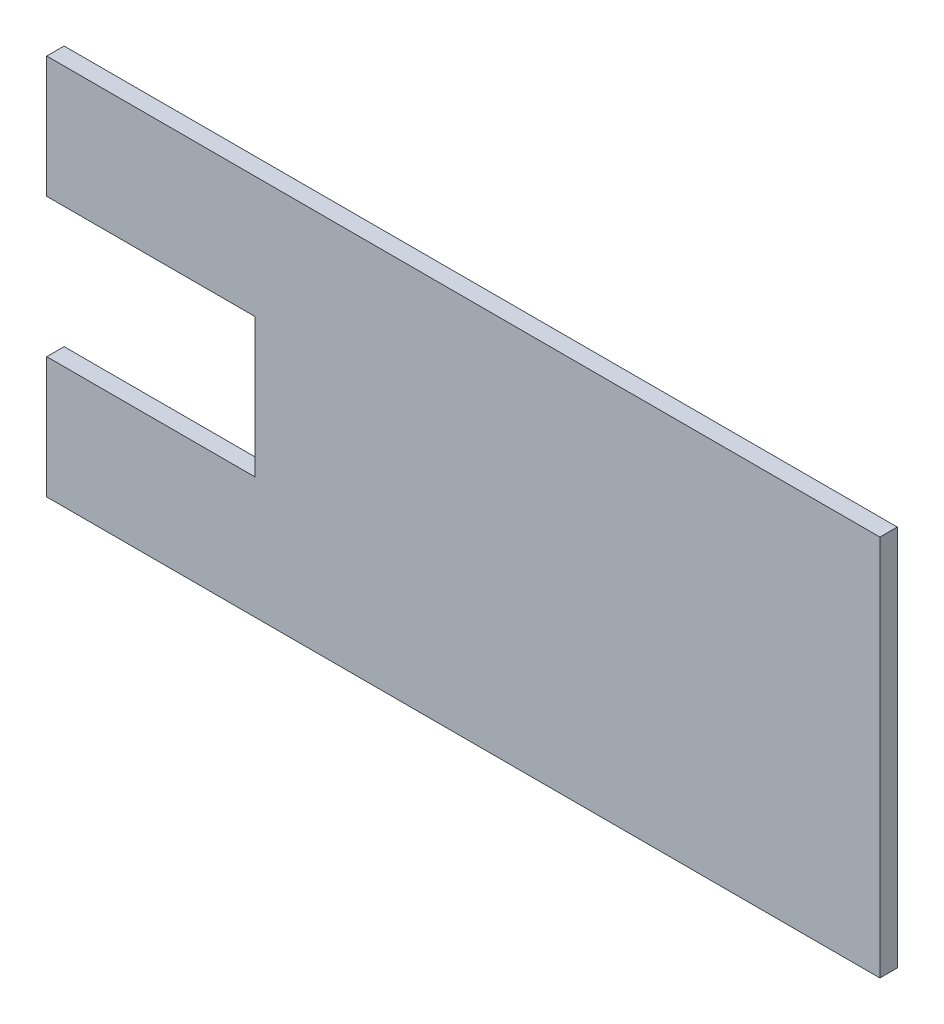
ISO-10303-21;
HEADER;
FILE_DESCRIPTION(('STEP AP214'),'2;1');
FILE_NAME('part.step','',(''),(''),'','','');
FILE_SCHEMA(('AUTOMOTIVE_DESIGN { 1 0 10303 214 1 1 1 1 }'));
ENDSEC;
DATA;
#1=APPLICATION_CONTEXT('core data for automotive mechanical design processes');
#2=APPLICATION_PROTOCOL_DEFINITION('international standard','automotive_design',2000,#1);
#3=PRODUCT_CONTEXT('',#1,'mechanical');
#4=PRODUCT('Part','Part','',(#3));
#5=PRODUCT_RELATED_PRODUCT_CATEGORY('part','',(#4));
#6=PRODUCT_DEFINITION_FORMATION('','',#4);
#7=PRODUCT_DEFINITION_CONTEXT('part definition',#1,'design');
#8=PRODUCT_DEFINITION('design','',#6,#7);
#9=PRODUCT_DEFINITION_SHAPE('','',#8);
#10=(LENGTH_UNIT() NAMED_UNIT(*) SI_UNIT(.MILLI.,.METRE.));
#11=(NAMED_UNIT(*) PLANE_ANGLE_UNIT() SI_UNIT($,.RADIAN.));
#12=(NAMED_UNIT(*) SI_UNIT($,.STERADIAN.) SOLID_ANGLE_UNIT());
#13=UNCERTAINTY_MEASURE_WITH_UNIT(LENGTH_MEASURE(1.E-05),#10,'distance_accuracy_value','');
#14=(GEOMETRIC_REPRESENTATION_CONTEXT(3) GLOBAL_UNCERTAINTY_ASSIGNED_CONTEXT((#13)) GLOBAL_UNIT_ASSIGNED_CONTEXT((#10,
#11,#12)) REPRESENTATION_CONTEXT('',''));
#15=CARTESIAN_POINT('',(0.,0.,0.));
#16=DIRECTION('',(0.,0.,1.));
#17=DIRECTION('',(1.,0.,0.));
#18=AXIS2_PLACEMENT_3D('',#15,#16,#17);
#19=CARTESIAN_POINT('',(0.,0.,3.175));
#20=DIRECTION('',(1.,0.,0.));
#21=DIRECTION('',(0.,0.,-1.));
#22=AXIS2_PLACEMENT_3D('',#19,#20,#21);
#23=PLANE('',#22);
#24=DIRECTION('',(0.,-1.,0.));
#25=VECTOR('',#24,1.);
#26=CARTESIAN_POINT('',(0.,0.,0.));
#27=LINE('',#26,#25);
#28=CARTESIAN_POINT('',(0.,69.85,0.));
#29=VERTEX_POINT('',#28);
#30=CARTESIAN_POINT('',(0.,47.625,0.));
#31=VERTEX_POINT('',#30);
#32=EDGE_CURVE('E141',#29,#31,#27,.T.);
#33=ORIENTED_EDGE('',*,*,#32,.T.);
#34=DIRECTION('',(0.,0.,1.));
#35=VECTOR('',#34,1.);
#36=CARTESIAN_POINT('',(0.,47.625,0.));
#37=LINE('',#36,#35);
#38=CARTESIAN_POINT('',(0.,47.625,3.175));
#39=VERTEX_POINT('',#38);
#40=EDGE_CURVE('E142',#31,#39,#37,.T.);
#41=ORIENTED_EDGE('',*,*,#40,.T.);
#42=DIRECTION('',(0.,-1.,0.));
#43=VECTOR('',#42,1.);
#44=CARTESIAN_POINT('',(0.,0.,3.175));
#45=LINE('',#44,#43);
#46=CARTESIAN_POINT('',(0.,69.85,3.175));
#47=VERTEX_POINT('',#46);
#48=EDGE_CURVE('E178',#47,#39,#45,.T.);
#49=ORIENTED_EDGE('',*,*,#48,.F.);
#50=DIRECTION('',(0.,0.,-1.));
#51=VECTOR('',#50,1.);
#52=CARTESIAN_POINT('',(0.,69.85,3.175));
#53=LINE('',#52,#51);
#54=EDGE_CURVE('E160',#47,#29,#53,.T.);
#55=ORIENTED_EDGE('',*,*,#54,.T.);
#56=EDGE_LOOP('',(#33,#41,#49,#55));
#57=FACE_BOUND('',#56,.T.);
#58=ADVANCED_FACE('F43',(#57),#23,.F.);
#59=CARTESIAN_POINT('',(0.,22.225,3.175));
#60=VERTEX_POINT('',#59);
#61=CARTESIAN_POINT('',(0.,0.,3.175));
#62=VERTEX_POINT('',#61);
#63=EDGE_CURVE('E96',#60,#62,#45,.T.);
#64=ORIENTED_EDGE('',*,*,#63,.F.);
#65=DIRECTION('',(0.,0.,1.));
#66=VECTOR('',#65,1.);
#67=CARTESIAN_POINT('',(0.,22.225,0.));
#68=LINE('',#67,#66);
#69=CARTESIAN_POINT('',(0.,22.225,0.));
#70=VERTEX_POINT('',#69);
#71=EDGE_CURVE('E122',#70,#60,#68,.T.);
#72=ORIENTED_EDGE('',*,*,#71,.F.);
#73=CARTESIAN_POINT('',(0.,0.,0.));
#74=VERTEX_POINT('',#73);
#75=EDGE_CURVE('E131',#70,#74,#27,.T.);
#76=ORIENTED_EDGE('',*,*,#75,.T.);
#77=DIRECTION('',(0.,0.,-1.));
#78=VECTOR('',#77,1.);
#79=CARTESIAN_POINT('',(0.,0.,3.175));
#80=LINE('',#79,#78);
#81=EDGE_CURVE('E11',#62,#74,#80,.T.);
#82=ORIENTED_EDGE('',*,*,#81,.F.);
#83=EDGE_LOOP('',(#64,#72,#76,#82));
#84=FACE_BOUND('',#83,.T.);
#85=ADVANCED_FACE('F45',(#84),#23,.F.);
#86=CARTESIAN_POINT('',(0.,0.,3.175));
#87=DIRECTION('',(0.,1.,0.));
#88=DIRECTION('',(0.,0.,1.));
#89=AXIS2_PLACEMENT_3D('',#86,#87,#88);
#90=PLANE('',#89);
#91=DIRECTION('',(1.,0.,0.));
#92=VECTOR('',#91,1.);
#93=CARTESIAN_POINT('',(0.,0.,0.));
#94=LINE('',#93,#92);
#95=CARTESIAN_POINT('',(152.4,0.,0.));
#96=VERTEX_POINT('',#95);
#97=EDGE_CURVE('E139',#74,#96,#94,.T.);
#98=ORIENTED_EDGE('',*,*,#97,.T.);
#99=DIRECTION('',(0.,0.,-1.));
#100=VECTOR('',#99,1.);
#101=CARTESIAN_POINT('',(152.4,0.,3.175));
#102=LINE('',#101,#100);
#103=CARTESIAN_POINT('',(152.4,0.,3.175));
#104=VERTEX_POINT('',#103);
#105=EDGE_CURVE('E52',#104,#96,#102,.T.);
#106=ORIENTED_EDGE('',*,*,#105,.F.);
#107=DIRECTION('',(1.,0.,0.));
#108=VECTOR('',#107,1.);
#109=CARTESIAN_POINT('',(0.,0.,3.175));
#110=LINE('',#109,#108);
#111=EDGE_CURVE('E182',#62,#104,#110,.T.);
#112=ORIENTED_EDGE('',*,*,#111,.F.);
#113=ORIENTED_EDGE('',*,*,#81,.T.);
#114=EDGE_LOOP('',(#98,#106,#112,#113));
#115=FACE_BOUND('',#114,.T.);
#116=ADVANCED_FACE('F222',(#115),#90,.F.);
#117=CARTESIAN_POINT('',(152.4,0.,3.175));
#118=DIRECTION('',(-1.,0.,0.));
#119=DIRECTION('',(0.,0.,1.));
#120=AXIS2_PLACEMENT_3D('',#117,#118,#119);
#121=PLANE('',#120);
#122=DIRECTION('',(0.,1.,0.));
#123=VECTOR('',#122,1.);
#124=CARTESIAN_POINT('',(152.4,0.,0.));
#125=LINE('',#124,#123);
#126=CARTESIAN_POINT('',(152.4,69.85,0.));
#127=VERTEX_POINT('',#126);
#128=EDGE_CURVE('E155',#96,#127,#125,.T.);
#129=ORIENTED_EDGE('',*,*,#128,.T.);
#130=DIRECTION('',(0.,0.,-1.));
#131=VECTOR('',#130,1.);
#132=CARTESIAN_POINT('',(152.4,69.85,3.175));
#133=LINE('',#132,#131);
#134=CARTESIAN_POINT('',(152.4,69.85,3.175));
#135=VERTEX_POINT('',#134);
#136=EDGE_CURVE('E163',#135,#127,#133,.T.);
#137=ORIENTED_EDGE('',*,*,#136,.F.);
#138=DIRECTION('',(0.,1.,0.));
#139=VECTOR('',#138,1.);
#140=CARTESIAN_POINT('',(152.4,0.,3.175));
#141=LINE('',#140,#139);
#142=EDGE_CURVE('E172',#104,#135,#141,.T.);
#143=ORIENTED_EDGE('',*,*,#142,.F.);
#144=ORIENTED_EDGE('',*,*,#105,.T.);
#145=EDGE_LOOP('',(#129,#137,#143,#144));
#146=FACE_BOUND('',#145,.T.);
#147=ADVANCED_FACE('F170',(#146),#121,.F.);
#148=CARTESIAN_POINT('',(0.,69.85,3.175));
#149=DIRECTION('',(0.,-1.,0.));
#150=DIRECTION('',(0.,0.,-1.));
#151=AXIS2_PLACEMENT_3D('',#148,#149,#150);
#152=PLANE('',#151);
#153=DIRECTION('',(-1.,0.,0.));
#154=VECTOR('',#153,1.);
#155=CARTESIAN_POINT('',(0.,69.85,0.));
#156=LINE('',#155,#154);
#157=EDGE_CURVE('E89',#127,#29,#156,.T.);
#158=ORIENTED_EDGE('',*,*,#157,.T.);
#159=ORIENTED_EDGE('',*,*,#54,.F.);
#160=DIRECTION('',(-1.,0.,0.));
#161=VECTOR('',#160,1.);
#162=CARTESIAN_POINT('',(0.,69.85,3.175));
#163=LINE('',#162,#161);
#164=EDGE_CURVE('E68',#135,#47,#163,.T.);
#165=ORIENTED_EDGE('',*,*,#164,.F.);
#166=ORIENTED_EDGE('',*,*,#136,.T.);
#167=EDGE_LOOP('',(#158,#159,#165,#166));
#168=FACE_BOUND('',#167,.T.);
#169=ADVANCED_FACE('F179',(#168),#152,.F.);
#170=CARTESIAN_POINT('',(0.,0.,3.175));
#171=DIRECTION('',(0.,0.,-1.));
#172=DIRECTION('',(-1.,0.,0.));
#173=AXIS2_PLACEMENT_3D('',#170,#171,#172);
#174=PLANE('',#173);
#175=ORIENTED_EDGE('',*,*,#48,.T.);
#176=DIRECTION('',(-1.,0.,0.));
#177=VECTOR('',#176,1.);
#178=CARTESIAN_POINT('',(0.,47.625,3.175));
#179=LINE('',#178,#177);
#180=CARTESIAN_POINT('',(38.1,47.625,3.175));
#181=VERTEX_POINT('',#180);
#182=EDGE_CURVE('E127',#181,#39,#179,.T.);
#183=ORIENTED_EDGE('',*,*,#182,.F.);
#184=DIRECTION('',(0.,1.,0.));
#185=VECTOR('',#184,1.);
#186=CARTESIAN_POINT('',(38.1,47.625,3.175));
#187=LINE('',#186,#185);
#188=CARTESIAN_POINT('',(38.1,22.225,3.175));
#189=VERTEX_POINT('',#188);
#190=EDGE_CURVE('E194',#189,#181,#187,.T.);
#191=ORIENTED_EDGE('',*,*,#190,.F.);
#192=DIRECTION('',(1.,0.,0.));
#193=VECTOR('',#192,1.);
#194=CARTESIAN_POINT('',(0.,22.225,3.175));
#195=LINE('',#194,#193);
#196=EDGE_CURVE('E198',#60,#189,#195,.T.);
#197=ORIENTED_EDGE('',*,*,#196,.F.);
#198=ORIENTED_EDGE('',*,*,#63,.T.);
#199=ORIENTED_EDGE('',*,*,#111,.T.);
#200=ORIENTED_EDGE('',*,*,#142,.T.);
#201=ORIENTED_EDGE('',*,*,#164,.T.);
#202=EDGE_LOOP('',(#175,#183,#191,#197,#198,#199,#200,#201));
#203=FACE_BOUND('',#202,.T.);
#204=ADVANCED_FACE('F206',(#203),#174,.F.);
#205=CARTESIAN_POINT('',(0.,0.,0.));
#206=DIRECTION('',(0.,0.,-1.));
#207=DIRECTION('',(-1.,0.,0.));
#208=AXIS2_PLACEMENT_3D('',#205,#206,#207);
#209=PLANE('',#208);
#210=DIRECTION('',(-1.,0.,0.));
#211=VECTOR('',#210,1.);
#212=CARTESIAN_POINT('',(0.,47.625,0.));
#213=LINE('',#212,#211);
#214=CARTESIAN_POINT('',(38.1,47.625,0.));
#215=VERTEX_POINT('',#214);
#216=EDGE_CURVE('E134',#215,#31,#213,.T.);
#217=ORIENTED_EDGE('',*,*,#216,.T.);
#218=ORIENTED_EDGE('',*,*,#32,.F.);
#219=ORIENTED_EDGE('',*,*,#157,.F.);
#220=ORIENTED_EDGE('',*,*,#128,.F.);
#221=ORIENTED_EDGE('',*,*,#97,.F.);
#222=ORIENTED_EDGE('',*,*,#75,.F.);
#223=DIRECTION('',(1.,0.,0.));
#224=VECTOR('',#223,1.);
#225=CARTESIAN_POINT('',(0.,22.225,0.));
#226=LINE('',#225,#224);
#227=CARTESIAN_POINT('',(38.1,22.225,0.));
#228=VERTEX_POINT('',#227);
#229=EDGE_CURVE('E118',#70,#228,#226,.T.);
#230=ORIENTED_EDGE('',*,*,#229,.T.);
#231=DIRECTION('',(0.,1.,0.));
#232=VECTOR('',#231,1.);
#233=CARTESIAN_POINT('',(38.1,47.625,0.));
#234=LINE('',#233,#232);
#235=EDGE_CURVE('E59',#228,#215,#234,.T.);
#236=ORIENTED_EDGE('',*,*,#235,.T.);
#237=EDGE_LOOP('',(#217,#218,#219,#220,#221,#222,#230,#236));
#238=FACE_BOUND('',#237,.T.);
#239=ADVANCED_FACE('F137',(#238),#209,.T.);
#240=CARTESIAN_POINT('',(0.,47.625,0.));
#241=DIRECTION('',(0.,1.,0.));
#242=DIRECTION('',(0.,0.,1.));
#243=AXIS2_PLACEMENT_3D('',#240,#241,#242);
#244=PLANE('',#243);
#245=ORIENTED_EDGE('',*,*,#182,.T.);
#246=ORIENTED_EDGE('',*,*,#40,.F.);
#247=ORIENTED_EDGE('',*,*,#216,.F.);
#248=DIRECTION('',(0.,0.,1.));
#249=VECTOR('',#248,1.);
#250=CARTESIAN_POINT('',(38.1,47.625,0.));
#251=LINE('',#250,#249);
#252=EDGE_CURVE('E148',#215,#181,#251,.T.);
#253=ORIENTED_EDGE('',*,*,#252,.T.);
#254=EDGE_LOOP('',(#245,#246,#247,#253));
#255=FACE_BOUND('',#254,.T.);
#256=ADVANCED_FACE('F209',(#255),#244,.F.);
#257=CARTESIAN_POINT('',(38.1,47.625,0.));
#258=DIRECTION('',(1.,0.,0.));
#259=DIRECTION('',(0.,0.,-1.));
#260=AXIS2_PLACEMENT_3D('',#257,#258,#259);
#261=PLANE('',#260);
#262=ORIENTED_EDGE('',*,*,#190,.T.);
#263=ORIENTED_EDGE('',*,*,#252,.F.);
#264=ORIENTED_EDGE('',*,*,#235,.F.);
#265=DIRECTION('',(0.,0.,1.));
#266=VECTOR('',#265,1.);
#267=CARTESIAN_POINT('',(38.1,22.225,0.));
#268=LINE('',#267,#266);
#269=EDGE_CURVE('E123',#228,#189,#268,.T.);
#270=ORIENTED_EDGE('',*,*,#269,.T.);
#271=EDGE_LOOP('',(#262,#263,#264,#270));
#272=FACE_BOUND('',#271,.T.);
#273=ADVANCED_FACE('F207',(#272),#261,.F.);
#274=CARTESIAN_POINT('',(0.,22.225,0.));
#275=DIRECTION('',(0.,-1.,0.));
#276=DIRECTION('',(0.,0.,-1.));
#277=AXIS2_PLACEMENT_3D('',#274,#275,#276);
#278=PLANE('',#277);
#279=ORIENTED_EDGE('',*,*,#196,.T.);
#280=ORIENTED_EDGE('',*,*,#269,.F.);
#281=ORIENTED_EDGE('',*,*,#229,.F.);
#282=ORIENTED_EDGE('',*,*,#71,.T.);
#283=EDGE_LOOP('',(#279,#280,#281,#282));
#284=FACE_BOUND('',#283,.T.);
#285=ADVANCED_FACE('F121',(#284),#278,.F.);
#286=CLOSED_SHELL('',(#58,#85,#116,#147,#169,#204,#239,#256,#273,#285));
#287=MANIFOLD_SOLID_BREP('B2',#286);
#288=ADVANCED_BREP_SHAPE_REPRESENTATION('',(#18,#287),#14);
#289=SHAPE_DEFINITION_REPRESENTATION(#9,#288);
ENDSEC;
END-ISO-10303-21;
